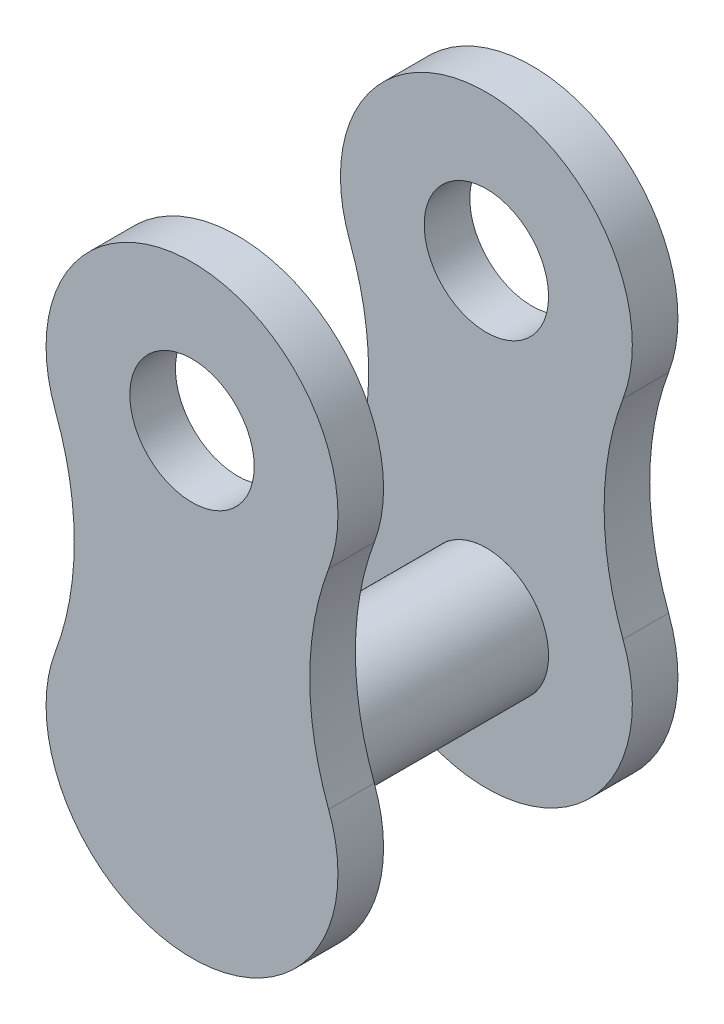
ISO-10303-21;
HEADER;
FILE_DESCRIPTION(('STEP AP214'),'2;1');
FILE_NAME('part.step','',(''),(''),'','','');
FILE_SCHEMA(('AUTOMOTIVE_DESIGN { 1 0 10303 214 1 1 1 1 }'));
ENDSEC;
DATA;
#1=APPLICATION_CONTEXT('core data for automotive mechanical design processes');
#2=APPLICATION_PROTOCOL_DEFINITION('international standard','automotive_design',2000,#1);
#3=PRODUCT_CONTEXT('',#1,'mechanical');
#4=PRODUCT('Part','Part','',(#3));
#5=PRODUCT_RELATED_PRODUCT_CATEGORY('part','',(#4));
#6=PRODUCT_DEFINITION_FORMATION('','',#4);
#7=PRODUCT_DEFINITION_CONTEXT('part definition',#1,'design');
#8=PRODUCT_DEFINITION('design','',#6,#7);
#9=PRODUCT_DEFINITION_SHAPE('','',#8);
#10=(LENGTH_UNIT() NAMED_UNIT(*) SI_UNIT(.MILLI.,.METRE.));
#11=(NAMED_UNIT(*) PLANE_ANGLE_UNIT() SI_UNIT($,.RADIAN.));
#12=(NAMED_UNIT(*) SI_UNIT($,.STERADIAN.) SOLID_ANGLE_UNIT());
#13=UNCERTAINTY_MEASURE_WITH_UNIT(LENGTH_MEASURE(1.E-05),#10,'distance_accuracy_value','');
#14=(GEOMETRIC_REPRESENTATION_CONTEXT(3) GLOBAL_UNCERTAINTY_ASSIGNED_CONTEXT((#13)) GLOBAL_UNIT_ASSIGNED_CONTEXT((#10,
#11,#12)) REPRESENTATION_CONTEXT('',''));
#15=CARTESIAN_POINT('',(0.,0.,0.));
#16=DIRECTION('',(0.,0.,1.));
#17=DIRECTION('',(1.,0.,0.));
#18=AXIS2_PLACEMENT_3D('',#15,#16,#17);
#19=CARTESIAN_POINT('',(0.,0.,9.017));
#20=DIRECTION('',(0.,0.,-1.));
#21=DIRECTION('',(-1.,0.,0.));
#22=AXIS2_PLACEMENT_3D('',#19,#20,#21);
#23=CYLINDRICAL_SURFACE('',#22,1.905);
#24=CARTESIAN_POINT('',(0.,0.,9.017));
#25=DIRECTION('',(0.,0.,1.));
#26=DIRECTION('',(1.,0.,0.));
#27=AXIS2_PLACEMENT_3D('',#24,#25,#26);
#28=CIRCLE('',#27,1.905);
#29=CARTESIAN_POINT('',(-1.905,0.,9.017));
#30=VERTEX_POINT('',#29);
#31=EDGE_CURVE('E16',#30,#30,#28,.T.);
#32=CARTESIAN_POINT('',(0.,0.,1.397));
#33=DIRECTION('',(0.,0.,1.));
#34=DIRECTION('',(1.,0.,0.));
#35=AXIS2_PLACEMENT_3D('',#32,#33,#34);
#36=CIRCLE('',#35,1.905);
#37=CARTESIAN_POINT('',(-1.905,0.,1.397));
#38=VERTEX_POINT('',#37);
#39=EDGE_CURVE('E133',#38,#38,#36,.T.);
#40=CARTESIAN_POINT('',(-1.905,0.,9.017));
#41=CARTESIAN_POINT('',(-1.905,0.,8.937625));
#42=CARTESIAN_POINT('',(-1.905,0.,8.85825));
#43=CARTESIAN_POINT('',(-1.905,0.,8.6995));
#44=CARTESIAN_POINT('',(-1.905,0.,8.620125));
#45=CARTESIAN_POINT('',(-1.905,0.,8.461375));
#46=CARTESIAN_POINT('',(-1.905,0.,8.382));
#47=CARTESIAN_POINT('',(-1.905,0.,8.22325));
#48=CARTESIAN_POINT('',(-1.905,0.,8.143875));
#49=CARTESIAN_POINT('',(-1.905,0.,7.985125));
#50=CARTESIAN_POINT('',(-1.905,0.,7.90575));
#51=CARTESIAN_POINT('',(-1.905,0.,7.747));
#52=CARTESIAN_POINT('',(-1.905,0.,7.667625));
#53=CARTESIAN_POINT('',(-1.905,0.,7.508875));
#54=CARTESIAN_POINT('',(-1.905,0.,7.4295));
#55=CARTESIAN_POINT('',(-1.905,0.,7.27075));
#56=CARTESIAN_POINT('',(-1.905,0.,7.191375));
#57=CARTESIAN_POINT('',(-1.905,0.,7.032625));
#58=CARTESIAN_POINT('',(-1.905,0.,6.95325));
#59=CARTESIAN_POINT('',(-1.905,0.,6.7945));
#60=CARTESIAN_POINT('',(-1.905,0.,6.715125));
#61=CARTESIAN_POINT('',(-1.905,0.,6.556375));
#62=CARTESIAN_POINT('',(-1.905,0.,6.477));
#63=CARTESIAN_POINT('',(-1.905,0.,6.31825));
#64=CARTESIAN_POINT('',(-1.905,0.,6.238875));
#65=CARTESIAN_POINT('',(-1.905,0.,6.080125));
#66=CARTESIAN_POINT('',(-1.905,0.,6.00075));
#67=CARTESIAN_POINT('',(-1.905,0.,5.842));
#68=CARTESIAN_POINT('',(-1.905,0.,5.762625));
#69=CARTESIAN_POINT('',(-1.905,0.,5.603875));
#70=CARTESIAN_POINT('',(-1.905,0.,5.5245));
#71=CARTESIAN_POINT('',(-1.905,0.,5.36575));
#72=CARTESIAN_POINT('',(-1.905,0.,5.286375));
#73=CARTESIAN_POINT('',(-1.905,0.,5.127625));
#74=CARTESIAN_POINT('',(-1.905,0.,5.04825));
#75=CARTESIAN_POINT('',(-1.905,0.,4.8895));
#76=CARTESIAN_POINT('',(-1.905,0.,4.810125));
#77=CARTESIAN_POINT('',(-1.905,0.,4.651375));
#78=CARTESIAN_POINT('',(-1.905,0.,4.572));
#79=CARTESIAN_POINT('',(-1.905,0.,4.41325));
#80=CARTESIAN_POINT('',(-1.905,0.,4.333875));
#81=CARTESIAN_POINT('',(-1.905,0.,4.175125));
#82=CARTESIAN_POINT('',(-1.905,0.,4.09575));
#83=CARTESIAN_POINT('',(-1.905,0.,3.937));
#84=CARTESIAN_POINT('',(-1.905,0.,3.857625));
#85=CARTESIAN_POINT('',(-1.905,0.,3.698875));
#86=CARTESIAN_POINT('',(-1.905,0.,3.6195));
#87=CARTESIAN_POINT('',(-1.905,0.,3.46075));
#88=CARTESIAN_POINT('',(-1.905,0.,3.381375));
#89=CARTESIAN_POINT('',(-1.905,0.,3.222625));
#90=CARTESIAN_POINT('',(-1.905,0.,3.14325));
#91=CARTESIAN_POINT('',(-1.905,0.,2.9845));
#92=CARTESIAN_POINT('',(-1.905,0.,2.905125));
#93=CARTESIAN_POINT('',(-1.905,0.,2.746375));
#94=CARTESIAN_POINT('',(-1.905,0.,2.667));
#95=CARTESIAN_POINT('',(-1.905,0.,2.50825));
#96=CARTESIAN_POINT('',(-1.905,0.,2.428875));
#97=CARTESIAN_POINT('',(-1.905,0.,2.270125));
#98=CARTESIAN_POINT('',(-1.905,0.,2.19075));
#99=CARTESIAN_POINT('',(-1.905,0.,2.032));
#100=CARTESIAN_POINT('',(-1.905,0.,1.952625));
#101=CARTESIAN_POINT('',(-1.905,0.,1.793875));
#102=CARTESIAN_POINT('',(-1.905,0.,1.7145));
#103=CARTESIAN_POINT('',(-1.905,0.,1.55575));
#104=CARTESIAN_POINT('',(-1.905,0.,1.476375));
#105=CARTESIAN_POINT('',(-1.905,0.,1.397));
#106=B_SPLINE_CURVE_WITH_KNOTS('',3,(#40,#41,#42,#43,#44,#45,#46,#47,#48,#49,#50,#51,#52,#53,
#54,#55,#56,#57,#58,#59,#60,#61,#62,#63,#64,#65,#66,#67,#68,#69,#70,#71,#72,#73,#74,#75,#76,#77,
#78,#79,#80,#81,#82,#83,#84,#85,#86,#87,#88,#89,#90,#91,#92,#93,#94,#95,#96,#97,#98,#99,#100,
#101,#102,#103,#104,#105),.UNSPECIFIED.,.F.,.F.,(4,2,2,2,2,2,2,2,2,2,2,2,2,2,2,2,2,2,2,2,2,2,2,
2,2,2,2,2,2,2,2,2,4),(0.,0.238125,0.476250000000001,0.714375000000001,0.9525,1.190625,1.42875,
1.666875,1.905,2.143125,2.38125,2.619375,2.8575,3.095625,3.33375,3.571875,3.81,4.048125,4.28625,
4.524375,4.7625,5.000625,5.23875,5.476875,5.715,5.953125,6.19125,6.429375,6.6675,6.905625,
7.14375,7.381875,7.62),.UNSPECIFIED.);
#107=EDGE_CURVE('BSEAM130',#30,#38,#106,.T.);
#108=ORIENTED_EDGE('',*,*,#31,.F.);
#109=ORIENTED_EDGE('',*,*,#39,.T.);
#110=ORIENTED_EDGE('',*,*,#107,.T.);
#111=ORIENTED_EDGE('',*,*,#107,.F.);
#112=EDGE_LOOP('',(#108,#110,#109,#111));
#113=FACE_BOUND('',#112,.T.);
#114=ADVANCED_FACE('F130',(#113),#23,.T.);
#115=CARTESIAN_POINT('',(0.,0.,1.397));
#116=DIRECTION('',(0.,0.,1.));
#117=DIRECTION('',(1.,0.,0.));
#118=AXIS2_PLACEMENT_3D('',#115,#116,#117);
#119=PLANE('',#118);
#120=ORIENTED_EDGE('',*,*,#39,.F.);
#121=EDGE_LOOP('',(#120));
#122=FACE_BOUND('',#121,.T.);
#123=ADVANCED_FACE('F211',(#122),#119,.F.);
#124=CARTESIAN_POINT('',(-6.35,7.14375,10.414));
#125=DIRECTION('',(0.,0.,1.));
#126=DIRECTION('',(1.,0.,0.));
#127=AXIS2_PLACEMENT_3D('',#124,#125,#126);
#128=PLANE('',#127);
#129=CARTESIAN_POINT('',(-12.7,4.7625,10.414));
#130=DIRECTION('',(0.,0.,-1.));
#131=DIRECTION('',(1.,0.,0.));
#132=AXIS2_PLACEMENT_3D('',#129,#130,#131);
#133=CIRCLE('',#132,9.09320594569158);
#134=CARTESIAN_POINT('',(-4.18576595540466,7.95533776672325,10.414));
#135=VERTEX_POINT('',#134);
#136=CARTESIAN_POINT('',(-4.18576595540466,1.56966223327675,10.414));
#137=VERTEX_POINT('',#136);
#138=EDGE_CURVE('E183',#135,#137,#133,.T.);
#139=ORIENTED_EDGE('',*,*,#138,.T.);
#140=CARTESIAN_POINT('',(0.,0.,10.414));
#141=DIRECTION('',(0.,0.,1.));
#142=DIRECTION('',(1.,0.,0.));
#143=AXIS2_PLACEMENT_3D('',#140,#141,#142);
#144=CIRCLE('',#143,4.4704);
#145=CARTESIAN_POINT('',(4.18576595540466,1.56966223327675,10.414));
#146=VERTEX_POINT('',#145);
#147=EDGE_CURVE('E177',#137,#146,#144,.T.);
#148=ORIENTED_EDGE('',*,*,#147,.T.);
#149=CARTESIAN_POINT('',(12.7,4.7625,10.414));
#150=DIRECTION('',(0.,0.,-1.));
#151=DIRECTION('',(1.,0.,0.));
#152=AXIS2_PLACEMENT_3D('',#149,#150,#151);
#153=CIRCLE('',#152,9.09320594569158);
#154=CARTESIAN_POINT('',(4.18576595540466,7.95533776672325,10.414));
#155=VERTEX_POINT('',#154);
#156=EDGE_CURVE('E181',#146,#155,#153,.T.);
#157=ORIENTED_EDGE('',*,*,#156,.T.);
#158=CARTESIAN_POINT('',(0.,9.525,10.414));
#159=DIRECTION('',(0.,0.,1.));
#160=DIRECTION('',(1.,0.,0.));
#161=AXIS2_PLACEMENT_3D('',#158,#159,#160);
#162=CIRCLE('',#161,4.4704);
#163=EDGE_CURVE('E146',#155,#135,#162,.T.);
#164=ORIENTED_EDGE('',*,*,#163,.T.);
#165=EDGE_LOOP('',(#139,#148,#157,#164));
#166=FACE_BOUND('',#165,.T.);
#167=CARTESIAN_POINT('',(0.,9.525,10.414));
#168=DIRECTION('',(0.,0.,1.));
#169=DIRECTION('',(1.,0.,0.));
#170=AXIS2_PLACEMENT_3D('',#167,#168,#169);
#171=CIRCLE('',#170,1.905);
#172=CARTESIAN_POINT('',(1.905,9.525,10.414));
#173=VERTEX_POINT('',#172);
#174=EDGE_CURVE('E201',#173,#173,#171,.T.);
#175=ORIENTED_EDGE('',*,*,#174,.F.);
#176=EDGE_LOOP('',(#175));
#177=FACE_BOUND('',#176,.T.);
#178=ADVANCED_FACE('F178',(#166,#177),#128,.T.);
#179=CARTESIAN_POINT('',(-6.35,7.14375,9.017));
#180=DIRECTION('',(0.,0.,1.));
#181=DIRECTION('',(1.,0.,0.));
#182=AXIS2_PLACEMENT_3D('',#179,#180,#181);
#183=PLANE('',#182);
#184=ORIENTED_EDGE('',*,*,#31,.T.);
#185=EDGE_LOOP('',(#184));
#186=FACE_BOUND('',#185,.T.);
#187=CARTESIAN_POINT('',(-12.7,4.7625,9.017));
#188=DIRECTION('',(0.,0.,-1.));
#189=DIRECTION('',(1.,0.,0.));
#190=AXIS2_PLACEMENT_3D('',#187,#188,#189);
#191=CIRCLE('',#190,9.09320594569158);
#192=CARTESIAN_POINT('',(-4.18576595540466,7.95533776672325,9.017));
#193=VERTEX_POINT('',#192);
#194=CARTESIAN_POINT('',(-4.18576595540466,1.56966223327675,9.017));
#195=VERTEX_POINT('',#194);
#196=EDGE_CURVE('E198',#193,#195,#191,.T.);
#197=ORIENTED_EDGE('',*,*,#196,.F.);
#198=CARTESIAN_POINT('',(0.,9.525,9.017));
#199=DIRECTION('',(0.,0.,1.));
#200=DIRECTION('',(1.,0.,0.));
#201=AXIS2_PLACEMENT_3D('',#198,#199,#200);
#202=CIRCLE('',#201,4.4704);
#203=CARTESIAN_POINT('',(4.18576595540466,7.95533776672325,9.017));
#204=VERTEX_POINT('',#203);
#205=EDGE_CURVE('E169',#204,#193,#202,.T.);
#206=ORIENTED_EDGE('',*,*,#205,.F.);
#207=CARTESIAN_POINT('',(12.7,4.7625,9.017));
#208=DIRECTION('',(0.,0.,-1.));
#209=DIRECTION('',(1.,0.,0.));
#210=AXIS2_PLACEMENT_3D('',#207,#208,#209);
#211=CIRCLE('',#210,9.09320594569158);
#212=CARTESIAN_POINT('',(4.18576595540466,1.56966223327675,9.017));
#213=VERTEX_POINT('',#212);
#214=EDGE_CURVE('E163',#213,#204,#211,.T.);
#215=ORIENTED_EDGE('',*,*,#214,.F.);
#216=CARTESIAN_POINT('',(0.,0.,9.017));
#217=DIRECTION('',(0.,0.,1.));
#218=DIRECTION('',(1.,0.,0.));
#219=AXIS2_PLACEMENT_3D('',#216,#217,#218);
#220=CIRCLE('',#219,4.4704);
#221=EDGE_CURVE('E188',#195,#213,#220,.T.);
#222=ORIENTED_EDGE('',*,*,#221,.F.);
#223=EDGE_LOOP('',(#197,#206,#215,#222));
#224=FACE_BOUND('',#223,.T.);
#225=CARTESIAN_POINT('',(0.,9.525,9.017));
#226=DIRECTION('',(0.,0.,1.));
#227=DIRECTION('',(1.,0.,0.));
#228=AXIS2_PLACEMENT_3D('',#225,#226,#227);
#229=CIRCLE('',#228,1.905);
#230=CARTESIAN_POINT('',(1.905,9.525,9.017));
#231=VERTEX_POINT('',#230);
#232=EDGE_CURVE('E245',#231,#231,#229,.T.);
#233=ORIENTED_EDGE('',*,*,#232,.T.);
#234=EDGE_LOOP('',(#233));
#235=FACE_BOUND('',#234,.T.);
#236=ADVANCED_FACE('F217',(#186,#224,#235),#183,.F.);
#237=CARTESIAN_POINT('',(-12.7,4.7625,10.414));
#238=DIRECTION('',(0.,0.,-1.));
#239=DIRECTION('',(-1.,0.,0.));
#240=AXIS2_PLACEMENT_3D('',#237,#238,#239);
#241=CYLINDRICAL_SURFACE('',#240,9.09320594569158);
#242=ORIENTED_EDGE('',*,*,#196,.T.);
#243=DIRECTION('',(0.,0.,-1.));
#244=VECTOR('',#243,1.);
#245=CARTESIAN_POINT('',(-4.18576595540466,1.56966223327675,10.414));
#246=LINE('',#245,#244);
#247=EDGE_CURVE('E189',#137,#195,#246,.T.);
#248=ORIENTED_EDGE('',*,*,#247,.F.);
#249=ORIENTED_EDGE('',*,*,#138,.F.);
#250=DIRECTION('',(0.,0.,-1.));
#251=VECTOR('',#250,1.);
#252=CARTESIAN_POINT('',(-4.18576595540466,7.95533776672325,10.414));
#253=LINE('',#252,#251);
#254=EDGE_CURVE('E194',#135,#193,#253,.T.);
#255=ORIENTED_EDGE('',*,*,#254,.T.);
#256=EDGE_LOOP('',(#242,#248,#249,#255));
#257=FACE_BOUND('',#256,.T.);
#258=ADVANCED_FACE('F221',(#257),#241,.F.);
#259=CARTESIAN_POINT('',(0.,0.,10.414));
#260=DIRECTION('',(0.,0.,-1.));
#261=DIRECTION('',(-1.,0.,0.));
#262=AXIS2_PLACEMENT_3D('',#259,#260,#261);
#263=CYLINDRICAL_SURFACE('',#262,4.4704);
#264=ORIENTED_EDGE('',*,*,#221,.T.);
#265=DIRECTION('',(0.,0.,-1.));
#266=VECTOR('',#265,1.);
#267=CARTESIAN_POINT('',(4.18576595540466,1.56966223327675,10.414));
#268=LINE('',#267,#266);
#269=EDGE_CURVE('E186',#146,#213,#268,.T.);
#270=ORIENTED_EDGE('',*,*,#269,.F.);
#271=ORIENTED_EDGE('',*,*,#147,.F.);
#272=ORIENTED_EDGE('',*,*,#247,.T.);
#273=EDGE_LOOP('',(#264,#270,#271,#272));
#274=FACE_BOUND('',#273,.T.);
#275=ADVANCED_FACE('F187',(#274),#263,.T.);
#276=CARTESIAN_POINT('',(12.7,4.7625,10.414));
#277=DIRECTION('',(0.,0.,-1.));
#278=DIRECTION('',(-1.,0.,0.));
#279=AXIS2_PLACEMENT_3D('',#276,#277,#278);
#280=CYLINDRICAL_SURFACE('',#279,9.09320594569158);
#281=ORIENTED_EDGE('',*,*,#214,.T.);
#282=DIRECTION('',(0.,0.,-1.));
#283=VECTOR('',#282,1.);
#284=CARTESIAN_POINT('',(4.18576595540466,7.95533776672325,10.414));
#285=LINE('',#284,#283);
#286=EDGE_CURVE('E190',#155,#204,#285,.T.);
#287=ORIENTED_EDGE('',*,*,#286,.F.);
#288=ORIENTED_EDGE('',*,*,#156,.F.);
#289=ORIENTED_EDGE('',*,*,#269,.T.);
#290=EDGE_LOOP('',(#281,#287,#288,#289));
#291=FACE_BOUND('',#290,.T.);
#292=ADVANCED_FACE('F192',(#291),#280,.F.);
#293=CARTESIAN_POINT('',(0.,9.525,10.414));
#294=DIRECTION('',(0.,0.,-1.));
#295=DIRECTION('',(-1.,0.,0.));
#296=AXIS2_PLACEMENT_3D('',#293,#294,#295);
#297=CYLINDRICAL_SURFACE('',#296,4.4704);
#298=ORIENTED_EDGE('',*,*,#205,.T.);
#299=ORIENTED_EDGE('',*,*,#254,.F.);
#300=ORIENTED_EDGE('',*,*,#163,.F.);
#301=ORIENTED_EDGE('',*,*,#286,.T.);
#302=EDGE_LOOP('',(#298,#299,#300,#301));
#303=FACE_BOUND('',#302,.T.);
#304=ADVANCED_FACE('F229',(#303),#297,.T.);
#305=CARTESIAN_POINT('',(0.,9.525,10.414));
#306=DIRECTION('',(0.,0.,-1.));
#307=DIRECTION('',(-1.,0.,0.));
#308=AXIS2_PLACEMENT_3D('',#305,#306,#307);
#309=CYLINDRICAL_SURFACE('',#308,1.905);
#310=ORIENTED_EDGE('',*,*,#174,.T.);
#311=EDGE_LOOP('',(#310));
#312=FACE_BOUND('',#311,.T.);
#313=ORIENTED_EDGE('',*,*,#232,.F.);
#314=EDGE_LOOP('',(#313));
#315=FACE_BOUND('',#314,.T.);
#316=ADVANCED_FACE('F232',(#312,#315),#309,.F.);
#317=CLOSED_SHELL('',(#114,#123,#178,#236,#258,#275,#292,#304,#316));
#318=MANIFOLD_SOLID_BREP('B2',#317);
#319=CARTESIAN_POINT('',(0.,0.,1.397));
#320=DIRECTION('',(0.,0.,-1.));
#321=DIRECTION('',(-1.,0.,0.));
#322=AXIS2_PLACEMENT_3D('',#319,#320,#321);
#323=CYLINDRICAL_SURFACE('',#322,4.4704);
#324=CARTESIAN_POINT('',(0.,0.,0.));
#325=DIRECTION('',(0.,0.,1.));
#326=DIRECTION('',(1.,0.,0.));
#327=AXIS2_PLACEMENT_3D('',#324,#325,#326);
#328=CIRCLE('',#327,4.4704);
#329=CARTESIAN_POINT('',(-4.18576595540466,1.56966223327675,0.));
#330=VERTEX_POINT('',#329);
#331=CARTESIAN_POINT('',(4.18576595540466,1.56966223327675,0.));
#332=VERTEX_POINT('',#331);
#333=EDGE_CURVE('E375',#330,#332,#328,.T.);
#334=ORIENTED_EDGE('',*,*,#333,.T.);
#335=DIRECTION('',(0.,0.,-1.));
#336=VECTOR('',#335,1.);
#337=CARTESIAN_POINT('',(4.18576595540466,1.56966223327675,1.397));
#338=LINE('',#337,#336);
#339=CARTESIAN_POINT('',(4.18576595540466,1.56966223327675,1.397));
#340=VERTEX_POINT('',#339);
#341=EDGE_CURVE('E128',#340,#332,#338,.T.);
#342=ORIENTED_EDGE('',*,*,#341,.F.);
#343=CARTESIAN_POINT('',(0.,0.,1.397));
#344=DIRECTION('',(0.,0.,1.));
#345=DIRECTION('',(1.,0.,0.));
#346=AXIS2_PLACEMENT_3D('',#343,#344,#345);
#347=CIRCLE('',#346,4.4704);
#348=CARTESIAN_POINT('',(-4.18576595540466,1.56966223327675,1.397));
#349=VERTEX_POINT('',#348);
#350=EDGE_CURVE('E355',#349,#340,#347,.T.);
#351=ORIENTED_EDGE('',*,*,#350,.F.);
#352=DIRECTION('',(0.,0.,-1.));
#353=VECTOR('',#352,1.);
#354=CARTESIAN_POINT('',(-4.18576595540466,1.56966223327675,1.397));
#355=LINE('',#354,#353);
#356=EDGE_CURVE('E321',#349,#330,#355,.T.);
#357=ORIENTED_EDGE('',*,*,#356,.T.);
#358=EDGE_LOOP('',(#334,#342,#351,#357));
#359=FACE_BOUND('',#358,.T.);
#360=ADVANCED_FACE('F304',(#359),#323,.T.);
#361=CARTESIAN_POINT('',(12.7,4.7625,1.397));
#362=DIRECTION('',(0.,0.,-1.));
#363=DIRECTION('',(-1.,0.,0.));
#364=AXIS2_PLACEMENT_3D('',#361,#362,#363);
#365=CYLINDRICAL_SURFACE('',#364,9.09320594569158);
#366=CARTESIAN_POINT('',(12.7,4.7625,0.));
#367=DIRECTION('',(0.,0.,1.));
#368=DIRECTION('',(1.,0.,0.));
#369=AXIS2_PLACEMENT_3D('',#366,#367,#368);
#370=CIRCLE('',#369,9.09320594569158);
#371=CARTESIAN_POINT('',(4.18576595540466,7.95533776672325,0.));
#372=VERTEX_POINT('',#371);
#373=EDGE_CURVE('E360',#332,#372,#370,.F.);
#374=ORIENTED_EDGE('',*,*,#373,.T.);
#375=DIRECTION('',(0.,0.,-1.));
#376=VECTOR('',#375,1.);
#377=CARTESIAN_POINT('',(4.18576595540466,7.95533776672325,1.397));
#378=LINE('',#377,#376);
#379=CARTESIAN_POINT('',(4.18576595540466,7.95533776672325,1.397));
#380=VERTEX_POINT('',#379);
#381=EDGE_CURVE('E313',#380,#372,#378,.T.);
#382=ORIENTED_EDGE('',*,*,#381,.F.);
#383=CARTESIAN_POINT('',(12.7,4.7625,1.397));
#384=DIRECTION('',(0.,0.,1.));
#385=DIRECTION('',(1.,0.,0.));
#386=AXIS2_PLACEMENT_3D('',#383,#384,#385);
#387=CIRCLE('',#386,9.09320594569158);
#388=EDGE_CURVE('E347',#340,#380,#387,.F.);
#389=ORIENTED_EDGE('',*,*,#388,.F.);
#390=ORIENTED_EDGE('',*,*,#341,.T.);
#391=EDGE_LOOP('',(#374,#382,#389,#390));
#392=FACE_BOUND('',#391,.T.);
#393=ADVANCED_FACE('F359',(#392),#365,.F.);
#394=CARTESIAN_POINT('',(0.,9.525,1.397));
#395=DIRECTION('',(0.,0.,-1.));
#396=DIRECTION('',(-1.,0.,0.));
#397=AXIS2_PLACEMENT_3D('',#394,#395,#396);
#398=CYLINDRICAL_SURFACE('',#397,4.4704);
#399=CARTESIAN_POINT('',(0.,9.525,0.));
#400=DIRECTION('',(0.,0.,1.));
#401=DIRECTION('',(1.,0.,0.));
#402=AXIS2_PLACEMENT_3D('',#399,#400,#401);
#403=CIRCLE('',#402,4.4704);
#404=CARTESIAN_POINT('',(-4.18576595540466,7.95533776672325,0.));
#405=VERTEX_POINT('',#404);
#406=EDGE_CURVE('E378',#372,#405,#403,.T.);
#407=ORIENTED_EDGE('',*,*,#406,.T.);
#408=DIRECTION('',(0.,0.,-1.));
#409=VECTOR('',#408,1.);
#410=CARTESIAN_POINT('',(-4.18576595540466,7.95533776672325,1.397));
#411=LINE('',#410,#409);
#412=CARTESIAN_POINT('',(-4.18576595540466,7.95533776672325,1.397));
#413=VERTEX_POINT('',#412);
#414=EDGE_CURVE('E336',#413,#405,#411,.T.);
#415=ORIENTED_EDGE('',*,*,#414,.F.);
#416=CARTESIAN_POINT('',(0.,9.525,1.397));
#417=DIRECTION('',(0.,0.,1.));
#418=DIRECTION('',(1.,0.,0.));
#419=AXIS2_PLACEMENT_3D('',#416,#417,#418);
#420=CIRCLE('',#419,4.4704);
#421=EDGE_CURVE('E354',#380,#413,#420,.T.);
#422=ORIENTED_EDGE('',*,*,#421,.F.);
#423=ORIENTED_EDGE('',*,*,#381,.T.);
#424=EDGE_LOOP('',(#407,#415,#422,#423));
#425=FACE_BOUND('',#424,.T.);
#426=ADVANCED_FACE('F363',(#425),#398,.T.);
#427=CARTESIAN_POINT('',(-12.7,4.7625,1.397));
#428=DIRECTION('',(0.,0.,-1.));
#429=DIRECTION('',(-1.,0.,0.));
#430=AXIS2_PLACEMENT_3D('',#427,#428,#429);
#431=CYLINDRICAL_SURFACE('',#430,9.09320594569158);
#432=CARTESIAN_POINT('',(-12.7,4.7625,0.));
#433=DIRECTION('',(0.,0.,1.));
#434=DIRECTION('',(1.,0.,0.));
#435=AXIS2_PLACEMENT_3D('',#432,#433,#434);
#436=CIRCLE('',#435,9.09320594569158);
#437=EDGE_CURVE('E380',#330,#405,#436,.T.);
#438=ORIENTED_EDGE('',*,*,#437,.F.);
#439=ORIENTED_EDGE('',*,*,#356,.F.);
#440=CARTESIAN_POINT('',(-12.7,4.7625,1.397));
#441=DIRECTION('',(0.,0.,1.));
#442=DIRECTION('',(1.,0.,0.));
#443=AXIS2_PLACEMENT_3D('',#440,#441,#442);
#444=CIRCLE('',#443,9.09320594569158);
#445=EDGE_CURVE('E364',#349,#413,#444,.T.);
#446=ORIENTED_EDGE('',*,*,#445,.T.);
#447=ORIENTED_EDGE('',*,*,#414,.T.);
#448=EDGE_LOOP('',(#438,#439,#446,#447));
#449=FACE_BOUND('',#448,.T.);
#450=ADVANCED_FACE('F416',(#449),#431,.F.);
#451=CARTESIAN_POINT('',(0.,0.,1.397));
#452=DIRECTION('',(0.,0.,-1.));
#453=DIRECTION('',(-1.,0.,0.));
#454=AXIS2_PLACEMENT_3D('',#451,#452,#453);
#455=CYLINDRICAL_SURFACE('',#454,1.905);
#456=CARTESIAN_POINT('',(0.,0.,1.397));
#457=DIRECTION('',(0.,0.,1.));
#458=DIRECTION('',(1.,0.,0.));
#459=AXIS2_PLACEMENT_3D('',#456,#457,#458);
#460=CIRCLE('',#459,1.905);
#461=CARTESIAN_POINT('',(1.905,0.,1.397));
#462=VERTEX_POINT('',#461);
#463=EDGE_CURVE('E386',#462,#462,#460,.T.);
#464=ORIENTED_EDGE('',*,*,#463,.T.);
#465=EDGE_LOOP('',(#464));
#466=FACE_BOUND('',#465,.T.);
#467=CARTESIAN_POINT('',(0.,0.,0.));
#468=DIRECTION('',(0.,0.,1.));
#469=DIRECTION('',(1.,0.,0.));
#470=AXIS2_PLACEMENT_3D('',#467,#468,#469);
#471=CIRCLE('',#470,1.905);
#472=CARTESIAN_POINT('',(1.905,0.,0.));
#473=VERTEX_POINT('',#472);
#474=EDGE_CURVE('E372',#473,#473,#471,.T.);
#475=ORIENTED_EDGE('',*,*,#474,.F.);
#476=EDGE_LOOP('',(#475));
#477=FACE_BOUND('',#476,.T.);
#478=ADVANCED_FACE('F306',(#466,#477),#455,.F.);
#479=CARTESIAN_POINT('',(0.,9.525,1.397));
#480=DIRECTION('',(0.,0.,-1.));
#481=DIRECTION('',(-1.,0.,0.));
#482=AXIS2_PLACEMENT_3D('',#479,#480,#481);
#483=CYLINDRICAL_SURFACE('',#482,1.905);
#484=CARTESIAN_POINT('',(0.,9.525,1.397));
#485=DIRECTION('',(0.,0.,1.));
#486=DIRECTION('',(1.,0.,0.));
#487=AXIS2_PLACEMENT_3D('',#484,#485,#486);
#488=CIRCLE('',#487,1.905);
#489=CARTESIAN_POINT('',(1.905,9.525,1.397));
#490=VERTEX_POINT('',#489);
#491=EDGE_CURVE('E366',#490,#490,#488,.T.);
#492=ORIENTED_EDGE('',*,*,#491,.T.);
#493=EDGE_LOOP('',(#492));
#494=FACE_BOUND('',#493,.T.);
#495=CARTESIAN_POINT('',(0.,9.525,0.));
#496=DIRECTION('',(0.,0.,1.));
#497=DIRECTION('',(1.,0.,0.));
#498=AXIS2_PLACEMENT_3D('',#495,#496,#497);
#499=CIRCLE('',#498,1.905);
#500=CARTESIAN_POINT('',(1.905,9.525,0.));
#501=VERTEX_POINT('',#500);
#502=EDGE_CURVE('E383',#501,#501,#499,.T.);
#503=ORIENTED_EDGE('',*,*,#502,.F.);
#504=EDGE_LOOP('',(#503));
#505=FACE_BOUND('',#504,.T.);
#506=ADVANCED_FACE('F398',(#494,#505),#483,.F.);
#507=CARTESIAN_POINT('',(0.,0.,1.397));
#508=DIRECTION('',(0.,0.,1.));
#509=DIRECTION('',(1.,0.,0.));
#510=AXIS2_PLACEMENT_3D('',#507,#508,#509);
#511=PLANE('',#510);
#512=ORIENTED_EDGE('',*,*,#463,.F.);
#513=EDGE_LOOP('',(#512));
#514=FACE_BOUND('',#513,.T.);
#515=ORIENTED_EDGE('',*,*,#350,.T.);
#516=ORIENTED_EDGE('',*,*,#388,.T.);
#517=ORIENTED_EDGE('',*,*,#421,.T.);
#518=ORIENTED_EDGE('',*,*,#445,.F.);
#519=EDGE_LOOP('',(#515,#516,#517,#518));
#520=FACE_BOUND('',#519,.T.);
#521=ORIENTED_EDGE('',*,*,#491,.F.);
#522=EDGE_LOOP('',(#521));
#523=FACE_BOUND('',#522,.T.);
#524=ADVANCED_FACE('F350',(#514,#520,#523),#511,.T.);
#525=CARTESIAN_POINT('',(0.,0.,0.));
#526=DIRECTION('',(0.,0.,1.));
#527=DIRECTION('',(1.,0.,0.));
#528=AXIS2_PLACEMENT_3D('',#525,#526,#527);
#529=PLANE('',#528);
#530=ORIENTED_EDGE('',*,*,#474,.T.);
#531=EDGE_LOOP('',(#530));
#532=FACE_BOUND('',#531,.T.);
#533=ORIENTED_EDGE('',*,*,#333,.F.);
#534=ORIENTED_EDGE('',*,*,#437,.T.);
#535=ORIENTED_EDGE('',*,*,#406,.F.);
#536=ORIENTED_EDGE('',*,*,#373,.F.);
#537=EDGE_LOOP('',(#533,#534,#535,#536));
#538=FACE_BOUND('',#537,.T.);
#539=ORIENTED_EDGE('',*,*,#502,.T.);
#540=EDGE_LOOP('',(#539));
#541=FACE_BOUND('',#540,.T.);
#542=ADVANCED_FACE('F397',(#532,#538,#541),#529,.F.);
#543=CLOSED_SHELL('',(#360,#393,#426,#450,#478,#506,#524,#542));
#544=MANIFOLD_SOLID_BREP('B10',#543);
#545=ADVANCED_BREP_SHAPE_REPRESENTATION('',(#18,#318,#544),#14);
#546=SHAPE_DEFINITION_REPRESENTATION(#9,#545);
ENDSEC;
END-ISO-10303-21;
